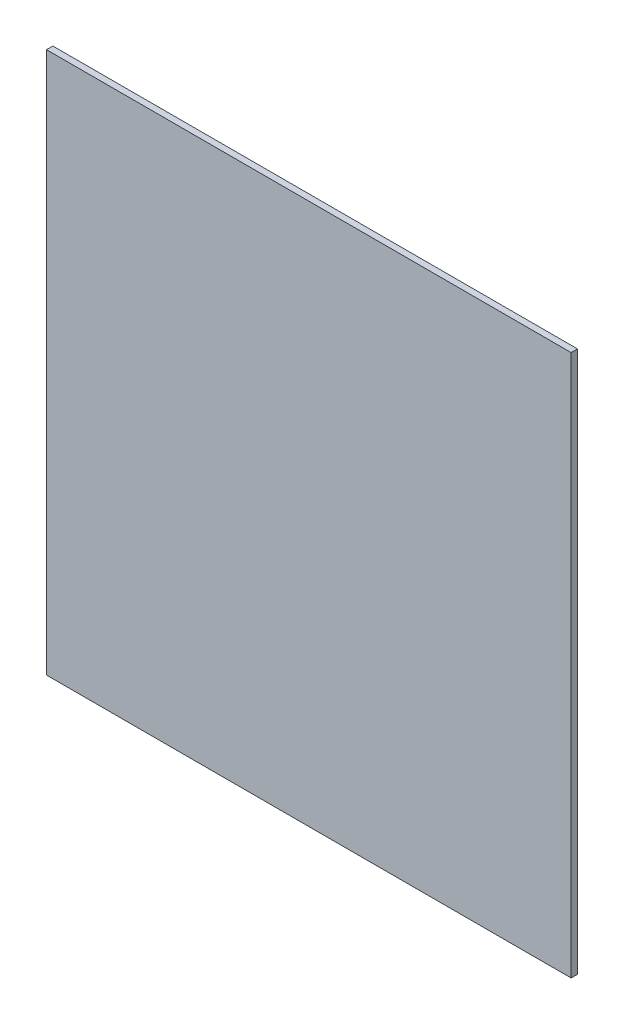
ISO-10303-21;
HEADER;
FILE_DESCRIPTION(('STEP AP214'),'2;1');
FILE_NAME('part.step','',(''),(''),'','','');
FILE_SCHEMA(('AUTOMOTIVE_DESIGN { 1 0 10303 214 1 1 1 1 }'));
ENDSEC;
DATA;
#1=APPLICATION_CONTEXT('core data for automotive mechanical design processes');
#2=APPLICATION_PROTOCOL_DEFINITION('international standard','automotive_design',2000,#1);
#3=PRODUCT_CONTEXT('',#1,'mechanical');
#4=PRODUCT('Part','Part','',(#3));
#5=PRODUCT_RELATED_PRODUCT_CATEGORY('part','',(#4));
#6=PRODUCT_DEFINITION_FORMATION('','',#4);
#7=PRODUCT_DEFINITION_CONTEXT('part definition',#1,'design');
#8=PRODUCT_DEFINITION('design','',#6,#7);
#9=PRODUCT_DEFINITION_SHAPE('','',#8);
#10=(LENGTH_UNIT() NAMED_UNIT(*) SI_UNIT(.MILLI.,.METRE.));
#11=(NAMED_UNIT(*) PLANE_ANGLE_UNIT() SI_UNIT($,.RADIAN.));
#12=(NAMED_UNIT(*) SI_UNIT($,.STERADIAN.) SOLID_ANGLE_UNIT());
#13=UNCERTAINTY_MEASURE_WITH_UNIT(LENGTH_MEASURE(1.E-05),#10,'distance_accuracy_value','');
#14=(GEOMETRIC_REPRESENTATION_CONTEXT(3) GLOBAL_UNCERTAINTY_ASSIGNED_CONTEXT((#13)) GLOBAL_UNIT_ASSIGNED_CONTEXT((#10,
#11,#12)) REPRESENTATION_CONTEXT('',''));
#15=CARTESIAN_POINT('',(0.,0.,0.));
#16=DIRECTION('',(0.,0.,1.));
#17=DIRECTION('',(1.,0.,0.));
#18=AXIS2_PLACEMENT_3D('',#15,#16,#17);
#19=CARTESIAN_POINT('',(123.75,-127.75,3.));
#20=DIRECTION('',(-1.,0.,0.));
#21=DIRECTION('',(0.,0.,1.));
#22=AXIS2_PLACEMENT_3D('',#19,#20,#21);
#23=PLANE('',#22);
#24=DIRECTION('',(0.,1.,0.));
#25=VECTOR('',#24,1.);
#26=CARTESIAN_POINT('',(123.75,-127.75,0.));
#27=LINE('',#26,#25);
#28=CARTESIAN_POINT('',(123.75,-127.75,0.));
#29=VERTEX_POINT('',#28);
#30=CARTESIAN_POINT('',(123.75,127.75,0.));
#31=VERTEX_POINT('',#30);
#32=EDGE_CURVE('E100',#29,#31,#27,.T.);
#33=ORIENTED_EDGE('',*,*,#32,.T.);
#34=DIRECTION('',(0.,0.,-1.));
#35=VECTOR('',#34,1.);
#36=CARTESIAN_POINT('',(123.75,127.75,3.));
#37=LINE('',#36,#35);
#38=CARTESIAN_POINT('',(123.75,127.75,3.));
#39=VERTEX_POINT('',#38);
#40=EDGE_CURVE('E11',#39,#31,#37,.T.);
#41=ORIENTED_EDGE('',*,*,#40,.F.);
#42=DIRECTION('',(0.,1.,0.));
#43=VECTOR('',#42,1.);
#44=CARTESIAN_POINT('',(123.75,-127.75,3.));
#45=LINE('',#44,#43);
#46=CARTESIAN_POINT('',(123.75,-127.75,3.));
#47=VERTEX_POINT('',#46);
#48=EDGE_CURVE('E88',#47,#39,#45,.T.);
#49=ORIENTED_EDGE('',*,*,#48,.F.);
#50=DIRECTION('',(0.,0.,-1.));
#51=VECTOR('',#50,1.);
#52=CARTESIAN_POINT('',(123.75,-127.75,3.));
#53=LINE('',#52,#51);
#54=EDGE_CURVE('E96',#47,#29,#53,.T.);
#55=ORIENTED_EDGE('',*,*,#54,.T.);
#56=EDGE_LOOP('',(#33,#41,#49,#55));
#57=FACE_BOUND('',#56,.T.);
#58=ADVANCED_FACE('F37',(#57),#23,.F.);
#59=CARTESIAN_POINT('',(-123.75,127.75,3.));
#60=DIRECTION('',(0.,-1.,0.));
#61=DIRECTION('',(0.,0.,-1.));
#62=AXIS2_PLACEMENT_3D('',#59,#60,#61);
#63=PLANE('',#62);
#64=DIRECTION('',(-1.,0.,0.));
#65=VECTOR('',#64,1.);
#66=CARTESIAN_POINT('',(-123.75,127.75,0.));
#67=LINE('',#66,#65);
#68=CARTESIAN_POINT('',(-123.75,127.75,0.));
#69=VERTEX_POINT('',#68);
#70=EDGE_CURVE('E92',#31,#69,#67,.T.);
#71=ORIENTED_EDGE('',*,*,#70,.T.);
#72=DIRECTION('',(0.,0.,-1.));
#73=VECTOR('',#72,1.);
#74=CARTESIAN_POINT('',(-123.75,127.75,3.));
#75=LINE('',#74,#73);
#76=CARTESIAN_POINT('',(-123.75,127.75,3.));
#77=VERTEX_POINT('',#76);
#78=EDGE_CURVE('E45',#77,#69,#75,.T.);
#79=ORIENTED_EDGE('',*,*,#78,.F.);
#80=DIRECTION('',(-1.,0.,0.));
#81=VECTOR('',#80,1.);
#82=CARTESIAN_POINT('',(-123.75,127.75,3.));
#83=LINE('',#82,#81);
#84=EDGE_CURVE('E83',#39,#77,#83,.T.);
#85=ORIENTED_EDGE('',*,*,#84,.F.);
#86=ORIENTED_EDGE('',*,*,#40,.T.);
#87=EDGE_LOOP('',(#71,#79,#85,#86));
#88=FACE_BOUND('',#87,.T.);
#89=ADVANCED_FACE('F91',(#88),#63,.F.);
#90=CARTESIAN_POINT('',(-123.75,-127.75,3.));
#91=DIRECTION('',(1.,0.,0.));
#92=DIRECTION('',(0.,0.,-1.));
#93=AXIS2_PLACEMENT_3D('',#90,#91,#92);
#94=PLANE('',#93);
#95=DIRECTION('',(0.,-1.,0.));
#96=VECTOR('',#95,1.);
#97=CARTESIAN_POINT('',(-123.75,-127.75,0.));
#98=LINE('',#97,#96);
#99=CARTESIAN_POINT('',(-123.75,-127.75,0.));
#100=VERTEX_POINT('',#99);
#101=EDGE_CURVE('E70',#69,#100,#98,.T.);
#102=ORIENTED_EDGE('',*,*,#101,.T.);
#103=DIRECTION('',(0.,0.,-1.));
#104=VECTOR('',#103,1.);
#105=CARTESIAN_POINT('',(-123.75,-127.75,3.));
#106=LINE('',#105,#104);
#107=CARTESIAN_POINT('',(-123.75,-127.75,3.));
#108=VERTEX_POINT('',#107);
#109=EDGE_CURVE('E93',#108,#100,#106,.T.);
#110=ORIENTED_EDGE('',*,*,#109,.F.);
#111=DIRECTION('',(0.,-1.,0.));
#112=VECTOR('',#111,1.);
#113=CARTESIAN_POINT('',(-123.75,-127.75,3.));
#114=LINE('',#113,#112);
#115=EDGE_CURVE('E86',#77,#108,#114,.T.);
#116=ORIENTED_EDGE('',*,*,#115,.F.);
#117=ORIENTED_EDGE('',*,*,#78,.T.);
#118=EDGE_LOOP('',(#102,#110,#116,#117));
#119=FACE_BOUND('',#118,.T.);
#120=ADVANCED_FACE('F94',(#119),#94,.F.);
#121=CARTESIAN_POINT('',(-123.75,-127.75,3.));
#122=DIRECTION('',(0.,1.,0.));
#123=DIRECTION('',(0.,0.,1.));
#124=AXIS2_PLACEMENT_3D('',#121,#122,#123);
#125=PLANE('',#124);
#126=DIRECTION('',(1.,0.,0.));
#127=VECTOR('',#126,1.);
#128=CARTESIAN_POINT('',(-123.75,-127.75,0.));
#129=LINE('',#128,#127);
#130=EDGE_CURVE('E76',#100,#29,#129,.T.);
#131=ORIENTED_EDGE('',*,*,#130,.T.);
#132=ORIENTED_EDGE('',*,*,#54,.F.);
#133=DIRECTION('',(1.,0.,0.));
#134=VECTOR('',#133,1.);
#135=CARTESIAN_POINT('',(-123.75,-127.75,3.));
#136=LINE('',#135,#134);
#137=EDGE_CURVE('E53',#108,#47,#136,.T.);
#138=ORIENTED_EDGE('',*,*,#137,.F.);
#139=ORIENTED_EDGE('',*,*,#109,.T.);
#140=EDGE_LOOP('',(#131,#132,#138,#139));
#141=FACE_BOUND('',#140,.T.);
#142=ADVANCED_FACE('F107',(#141),#125,.F.);
#143=CARTESIAN_POINT('',(0.,0.,3.));
#144=DIRECTION('',(0.,0.,-1.));
#145=DIRECTION('',(-1.,0.,0.));
#146=AXIS2_PLACEMENT_3D('',#143,#144,#145);
#147=PLANE('',#146);
#148=ORIENTED_EDGE('',*,*,#48,.T.);
#149=ORIENTED_EDGE('',*,*,#84,.T.);
#150=ORIENTED_EDGE('',*,*,#115,.T.);
#151=ORIENTED_EDGE('',*,*,#137,.T.);
#152=EDGE_LOOP('',(#148,#149,#150,#151));
#153=FACE_BOUND('',#152,.T.);
#154=ADVANCED_FACE('F84',(#153),#147,.F.);
#155=CARTESIAN_POINT('',(0.,0.,0.));
#156=DIRECTION('',(0.,0.,-1.));
#157=DIRECTION('',(-1.,0.,0.));
#158=AXIS2_PLACEMENT_3D('',#155,#156,#157);
#159=PLANE('',#158);
#160=ORIENTED_EDGE('',*,*,#32,.F.);
#161=ORIENTED_EDGE('',*,*,#130,.F.);
#162=ORIENTED_EDGE('',*,*,#101,.F.);
#163=ORIENTED_EDGE('',*,*,#70,.F.);
#164=EDGE_LOOP('',(#160,#161,#162,#163));
#165=FACE_BOUND('',#164,.T.);
#166=ADVANCED_FACE('F110',(#165),#159,.T.);
#167=CLOSED_SHELL('',(#58,#89,#120,#142,#154,#166));
#168=MANIFOLD_SOLID_BREP('B2',#167);
#169=ADVANCED_BREP_SHAPE_REPRESENTATION('',(#18,#168),#14);
#170=SHAPE_DEFINITION_REPRESENTATION(#9,#169);
ENDSEC;
END-ISO-10303-21;
